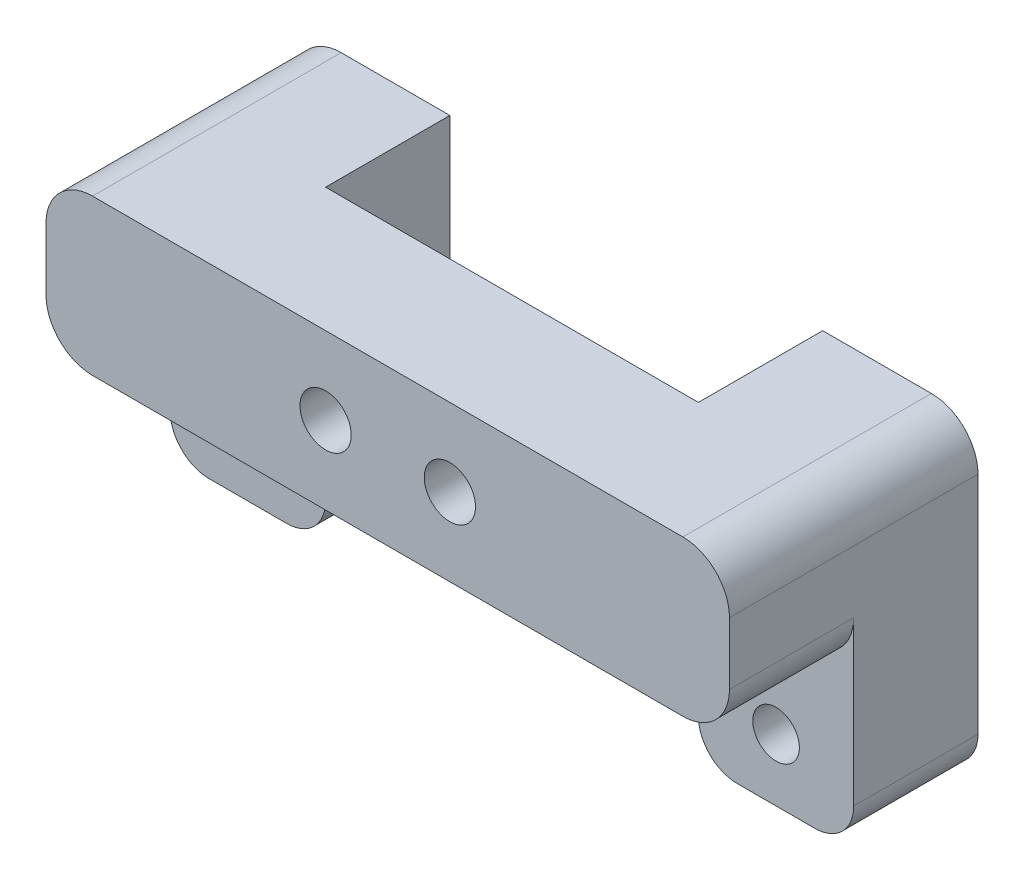
ISO-10303-21;
HEADER;
FILE_DESCRIPTION(('STEP AP214'),'2;1');
FILE_NAME('part.step','',(''),(''),'','','');
FILE_SCHEMA(('AUTOMOTIVE_DESIGN { 1 0 10303 214 1 1 1 1 }'));
ENDSEC;
DATA;
#1=APPLICATION_CONTEXT('core data for automotive mechanical design processes');
#2=APPLICATION_PROTOCOL_DEFINITION('international standard','automotive_design',2000,#1);
#3=PRODUCT_CONTEXT('',#1,'mechanical');
#4=PRODUCT('Part','Part','',(#3));
#5=PRODUCT_RELATED_PRODUCT_CATEGORY('part','',(#4));
#6=PRODUCT_DEFINITION_FORMATION('','',#4);
#7=PRODUCT_DEFINITION_CONTEXT('part definition',#1,'design');
#8=PRODUCT_DEFINITION('design','',#6,#7);
#9=PRODUCT_DEFINITION_SHAPE('','',#8);
#10=(LENGTH_UNIT() NAMED_UNIT(*) SI_UNIT(.MILLI.,.METRE.));
#11=(NAMED_UNIT(*) PLANE_ANGLE_UNIT() SI_UNIT($,.RADIAN.));
#12=(NAMED_UNIT(*) SI_UNIT($,.STERADIAN.) SOLID_ANGLE_UNIT());
#13=UNCERTAINTY_MEASURE_WITH_UNIT(LENGTH_MEASURE(1.E-05),#10,'distance_accuracy_value','');
#14=(GEOMETRIC_REPRESENTATION_CONTEXT(3) GLOBAL_UNCERTAINTY_ASSIGNED_CONTEXT((#13)) GLOBAL_UNIT_ASSIGNED_CONTEXT((#10,
#11,#12)) REPRESENTATION_CONTEXT('',''));
#15=CARTESIAN_POINT('',(0.,0.,0.));
#16=DIRECTION('',(0.,0.,1.));
#17=DIRECTION('',(1.,0.,0.));
#18=AXIS2_PLACEMENT_3D('',#15,#16,#17);
#19=CARTESIAN_POINT('',(0.,-10.,8.));
#20=DIRECTION('',(0.,1.,0.));
#21=DIRECTION('',(0.,0.,1.));
#22=AXIS2_PLACEMENT_3D('',#19,#20,#21);
#23=PLANE('',#22);
#24=DIRECTION('',(1.,0.,0.));
#25=VECTOR('',#24,1.);
#26=CARTESIAN_POINT('',(0.,-10.,8.));
#27=LINE('',#26,#25);
#28=CARTESIAN_POINT('',(3.,-10.,8.));
#29=VERTEX_POINT('',#28);
#30=CARTESIAN_POINT('',(41.,-10.,8.));
#31=VERTEX_POINT('',#30);
#32=EDGE_CURVE('E301',#29,#31,#27,.T.);
#33=ORIENTED_EDGE('',*,*,#32,.F.);
#34=DIRECTION('',(0.,0.,-1.));
#35=VECTOR('',#34,1.);
#36=CARTESIAN_POINT('',(3.,-10.,8.));
#37=LINE('',#36,#35);
#38=CARTESIAN_POINT('',(3.,-10.,0.));
#39=VERTEX_POINT('',#38);
#40=EDGE_CURVE('E254',#29,#39,#37,.T.);
#41=ORIENTED_EDGE('',*,*,#40,.T.);
#42=DIRECTION('',(-1.,0.,0.));
#43=VECTOR('',#42,1.);
#44=CARTESIAN_POINT('',(10.,-10.,0.));
#45=LINE('',#44,#43);
#46=CARTESIAN_POINT('',(10.,-10.,0.));
#47=VERTEX_POINT('',#46);
#48=EDGE_CURVE('E204',#47,#39,#45,.T.);
#49=ORIENTED_EDGE('',*,*,#48,.F.);
#50=DIRECTION('',(1.,0.,0.));
#51=VECTOR('',#50,1.);
#52=CARTESIAN_POINT('',(0.,-10.,0.));
#53=LINE('',#52,#51);
#54=CARTESIAN_POINT('',(34.,-10.,0.));
#55=VERTEX_POINT('',#54);
#56=EDGE_CURVE('E194',#47,#55,#53,.T.);
#57=ORIENTED_EDGE('',*,*,#56,.T.);
#58=DIRECTION('',(-1.,0.,0.));
#59=VECTOR('',#58,1.);
#60=CARTESIAN_POINT('',(34.,-10.,0.));
#61=LINE('',#60,#59);
#62=CARTESIAN_POINT('',(41.,-10.,0.));
#63=VERTEX_POINT('',#62);
#64=EDGE_CURVE('E164',#63,#55,#61,.T.);
#65=ORIENTED_EDGE('',*,*,#64,.F.);
#66=DIRECTION('',(0.,0.,-1.));
#67=VECTOR('',#66,1.);
#68=CARTESIAN_POINT('',(41.,-10.,8.));
#69=LINE('',#68,#67);
#70=EDGE_CURVE('E252',#63,#31,#69,.F.);
#71=ORIENTED_EDGE('',*,*,#70,.T.);
#72=EDGE_LOOP('',(#33,#41,#49,#57,#65,#71));
#73=FACE_BOUND('',#72,.T.);
#74=ADVANCED_FACE('F33',(#73),#23,.F.);
#75=CARTESIAN_POINT('',(0.,0.,0.));
#76=DIRECTION('',(0.,0.,1.));
#77=DIRECTION('',(1.,0.,0.));
#78=AXIS2_PLACEMENT_3D('',#75,#76,#77);
#79=PLANE('',#78);
#80=CARTESIAN_POINT('',(26.,-5.,0.));
#81=DIRECTION('',(0.,0.,1.));
#82=DIRECTION('',(1.,0.,0.));
#83=AXIS2_PLACEMENT_3D('',#80,#81,#82);
#84=CIRCLE('',#83,1.65);
#85=CARTESIAN_POINT('',(27.65,-5.,0.));
#86=VERTEX_POINT('',#85);
#87=EDGE_CURVE('E353',#86,#86,#84,.T.);
#88=ORIENTED_EDGE('',*,*,#87,.T.);
#89=EDGE_LOOP('',(#88));
#90=FACE_BOUND('',#89,.T.);
#91=CARTESIAN_POINT('',(18.,-5.,0.));
#92=DIRECTION('',(0.,0.,1.));
#93=DIRECTION('',(1.,0.,0.));
#94=AXIS2_PLACEMENT_3D('',#91,#92,#93);
#95=CIRCLE('',#94,1.65);
#96=CARTESIAN_POINT('',(19.65,-5.,0.));
#97=VERTEX_POINT('',#96);
#98=EDGE_CURVE('E198',#97,#97,#95,.T.);
#99=ORIENTED_EDGE('',*,*,#98,.T.);
#100=EDGE_LOOP('',(#99));
#101=FACE_BOUND('',#100,.T.);
#102=DIRECTION('',(0.,1.,0.));
#103=VECTOR('',#102,1.);
#104=CARTESIAN_POINT('',(34.,-10.,0.));
#105=LINE('',#104,#103);
#106=CARTESIAN_POINT('',(34.,0.,0.));
#107=VERTEX_POINT('',#106);
#108=EDGE_CURVE('E183',#55,#107,#105,.T.);
#109=ORIENTED_EDGE('',*,*,#108,.F.);
#110=ORIENTED_EDGE('',*,*,#56,.F.);
#111=DIRECTION('',(0.,-1.,0.));
#112=VECTOR('',#111,1.);
#113=CARTESIAN_POINT('',(10.,-10.,0.));
#114=LINE('',#113,#112);
#115=CARTESIAN_POINT('',(10.,0.,0.));
#116=VERTEX_POINT('',#115);
#117=EDGE_CURVE('E319',#116,#47,#114,.T.);
#118=ORIENTED_EDGE('',*,*,#117,.F.);
#119=DIRECTION('',(-1.,0.,0.));
#120=VECTOR('',#119,1.);
#121=CARTESIAN_POINT('',(0.,0.,0.));
#122=LINE('',#121,#120);
#123=EDGE_CURVE('E196',#107,#116,#122,.T.);
#124=ORIENTED_EDGE('',*,*,#123,.F.);
#125=EDGE_LOOP('',(#109,#110,#118,#124));
#126=FACE_BOUND('',#125,.T.);
#127=ADVANCED_FACE('F192',(#90,#101,#126),#79,.F.);
#128=CARTESIAN_POINT('',(0.,0.,8.));
#129=DIRECTION('',(1.,0.,0.));
#130=DIRECTION('',(0.,0.,-1.));
#131=AXIS2_PLACEMENT_3D('',#128,#129,#130);
#132=PLANE('',#131);
#133=DIRECTION('',(0.,1.,0.));
#134=VECTOR('',#133,1.);
#135=CARTESIAN_POINT('',(0.,-20.,0.));
#136=LINE('',#135,#134);
#137=CARTESIAN_POINT('',(0.,-17.5,0.));
#138=VERTEX_POINT('',#137);
#139=CARTESIAN_POINT('',(0.,-7.,0.));
#140=VERTEX_POINT('',#139);
#141=EDGE_CURVE('E285',#138,#140,#136,.T.);
#142=ORIENTED_EDGE('',*,*,#141,.T.);
#143=DIRECTION('',(0.,0.,-1.));
#144=VECTOR('',#143,1.);
#145=CARTESIAN_POINT('',(0.,-7.,8.));
#146=LINE('',#145,#144);
#147=CARTESIAN_POINT('',(0.,-7.,8.));
#148=VERTEX_POINT('',#147);
#149=EDGE_CURVE('E259',#140,#148,#146,.F.);
#150=ORIENTED_EDGE('',*,*,#149,.T.);
#151=DIRECTION('',(0.,-1.,0.));
#152=VECTOR('',#151,1.);
#153=CARTESIAN_POINT('',(0.,0.,8.));
#154=LINE('',#153,#152);
#155=CARTESIAN_POINT('',(0.,-3.,8.));
#156=VERTEX_POINT('',#155);
#157=EDGE_CURVE('E207',#156,#148,#154,.T.);
#158=ORIENTED_EDGE('',*,*,#157,.F.);
#159=DIRECTION('',(0.,0.,-1.));
#160=VECTOR('',#159,1.);
#161=CARTESIAN_POINT('',(0.,-3.,8.));
#162=LINE('',#161,#160);
#163=CARTESIAN_POINT('',(0.,-3.,-8.));
#164=VERTEX_POINT('',#163);
#165=EDGE_CURVE('E256',#156,#164,#162,.T.);
#166=ORIENTED_EDGE('',*,*,#165,.T.);
#167=DIRECTION('',(0.,1.,0.));
#168=VECTOR('',#167,1.);
#169=CARTESIAN_POINT('',(0.,-10.,-8.));
#170=LINE('',#169,#168);
#171=CARTESIAN_POINT('',(0.,-17.5,-8.));
#172=VERTEX_POINT('',#171);
#173=EDGE_CURVE('E314',#172,#164,#170,.T.);
#174=ORIENTED_EDGE('',*,*,#173,.F.);
#175=DIRECTION('',(0.,0.,-1.));
#176=VECTOR('',#175,1.);
#177=CARTESIAN_POINT('',(0.,-17.5,8.));
#178=LINE('',#177,#176);
#179=EDGE_CURVE('E250',#172,#138,#178,.F.);
#180=ORIENTED_EDGE('',*,*,#179,.T.);
#181=EDGE_LOOP('',(#142,#150,#158,#166,#174,#180));
#182=FACE_BOUND('',#181,.T.);
#183=ADVANCED_FACE('F294',(#182),#132,.F.);
#184=CARTESIAN_POINT('',(44.,0.,8.));
#185=DIRECTION('',(-1.,0.,0.));
#186=DIRECTION('',(0.,0.,1.));
#187=AXIS2_PLACEMENT_3D('',#184,#185,#186);
#188=PLANE('',#187);
#189=DIRECTION('',(0.,1.,0.));
#190=VECTOR('',#189,1.);
#191=CARTESIAN_POINT('',(44.,0.,8.));
#192=LINE('',#191,#190);
#193=CARTESIAN_POINT('',(44.,-7.,8.));
#194=VERTEX_POINT('',#193);
#195=CARTESIAN_POINT('',(44.,-3.,8.));
#196=VERTEX_POINT('',#195);
#197=EDGE_CURVE('E303',#194,#196,#192,.T.);
#198=ORIENTED_EDGE('',*,*,#197,.F.);
#199=DIRECTION('',(0.,0.,-1.));
#200=VECTOR('',#199,1.);
#201=CARTESIAN_POINT('',(44.,-7.,8.));
#202=LINE('',#201,#200);
#203=CARTESIAN_POINT('',(44.,-7.,0.));
#204=VERTEX_POINT('',#203);
#205=EDGE_CURVE('E271',#194,#204,#202,.T.);
#206=ORIENTED_EDGE('',*,*,#205,.T.);
#207=DIRECTION('',(0.,1.,0.));
#208=VECTOR('',#207,1.);
#209=CARTESIAN_POINT('',(44.,-20.,0.));
#210=LINE('',#209,#208);
#211=CARTESIAN_POINT('',(44.,-17.5,0.));
#212=VERTEX_POINT('',#211);
#213=EDGE_CURVE('E187',#212,#204,#210,.T.);
#214=ORIENTED_EDGE('',*,*,#213,.F.);
#215=DIRECTION('',(0.,0.,1.));
#216=VECTOR('',#215,1.);
#217=CARTESIAN_POINT('',(44.,-17.5,-8.));
#218=LINE('',#217,#216);
#219=CARTESIAN_POINT('',(44.,-17.5,-8.));
#220=VERTEX_POINT('',#219);
#221=EDGE_CURVE('E226',#212,#220,#218,.F.);
#222=ORIENTED_EDGE('',*,*,#221,.T.);
#223=DIRECTION('',(0.,-1.,0.));
#224=VECTOR('',#223,1.);
#225=CARTESIAN_POINT('',(44.,-10.,-8.));
#226=LINE('',#225,#224);
#227=CARTESIAN_POINT('',(44.,-3.,-8.));
#228=VERTEX_POINT('',#227);
#229=EDGE_CURVE('E197',#228,#220,#226,.T.);
#230=ORIENTED_EDGE('',*,*,#229,.F.);
#231=DIRECTION('',(0.,0.,-1.));
#232=VECTOR('',#231,1.);
#233=CARTESIAN_POINT('',(44.,-3.,8.));
#234=LINE('',#233,#232);
#235=EDGE_CURVE('E269',#228,#196,#234,.F.);
#236=ORIENTED_EDGE('',*,*,#235,.T.);
#237=EDGE_LOOP('',(#198,#206,#214,#222,#230,#236));
#238=FACE_BOUND('',#237,.T.);
#239=ADVANCED_FACE('F420',(#238),#188,.F.);
#240=CARTESIAN_POINT('',(0.,0.,8.));
#241=DIRECTION('',(0.,-1.,0.));
#242=DIRECTION('',(0.,0.,-1.));
#243=AXIS2_PLACEMENT_3D('',#240,#241,#242);
#244=PLANE('',#243);
#245=DIRECTION('',(-1.,0.,0.));
#246=VECTOR('',#245,1.);
#247=CARTESIAN_POINT('',(0.,0.,8.));
#248=LINE('',#247,#246);
#249=CARTESIAN_POINT('',(41.,0.,8.));
#250=VERTEX_POINT('',#249);
#251=CARTESIAN_POINT('',(3.,0.,8.));
#252=VERTEX_POINT('',#251);
#253=EDGE_CURVE('E213',#250,#252,#248,.T.);
#254=ORIENTED_EDGE('',*,*,#253,.F.);
#255=DIRECTION('',(0.,0.,-1.));
#256=VECTOR('',#255,1.);
#257=CARTESIAN_POINT('',(41.,0.,8.));
#258=LINE('',#257,#256);
#259=CARTESIAN_POINT('',(41.,0.,-8.));
#260=VERTEX_POINT('',#259);
#261=EDGE_CURVE('E276',#250,#260,#258,.T.);
#262=ORIENTED_EDGE('',*,*,#261,.T.);
#263=DIRECTION('',(1.,0.,0.));
#264=VECTOR('',#263,1.);
#265=CARTESIAN_POINT('',(44.,0.,-8.));
#266=LINE('',#265,#264);
#267=CARTESIAN_POINT('',(34.,0.,-8.));
#268=VERTEX_POINT('',#267);
#269=EDGE_CURVE('E364',#268,#260,#266,.T.);
#270=ORIENTED_EDGE('',*,*,#269,.F.);
#271=DIRECTION('',(0.,0.,1.));
#272=VECTOR('',#271,1.);
#273=CARTESIAN_POINT('',(34.,0.,-8.));
#274=LINE('',#273,#272);
#275=EDGE_CURVE('E322',#268,#107,#274,.T.);
#276=ORIENTED_EDGE('',*,*,#275,.T.);
#277=ORIENTED_EDGE('',*,*,#123,.T.);
#278=DIRECTION('',(0.,0.,1.));
#279=VECTOR('',#278,1.);
#280=CARTESIAN_POINT('',(10.,0.,-8.));
#281=LINE('',#280,#279);
#282=CARTESIAN_POINT('',(10.,0.,-8.));
#283=VERTEX_POINT('',#282);
#284=EDGE_CURVE('E205',#283,#116,#281,.T.);
#285=ORIENTED_EDGE('',*,*,#284,.F.);
#286=DIRECTION('',(1.,0.,0.));
#287=VECTOR('',#286,1.);
#288=CARTESIAN_POINT('',(0.,0.,-8.));
#289=LINE('',#288,#287);
#290=CARTESIAN_POINT('',(3.,0.,-8.));
#291=VERTEX_POINT('',#290);
#292=EDGE_CURVE('E318',#291,#283,#289,.T.);
#293=ORIENTED_EDGE('',*,*,#292,.F.);
#294=DIRECTION('',(0.,0.,-1.));
#295=VECTOR('',#294,1.);
#296=CARTESIAN_POINT('',(3.,0.,8.));
#297=LINE('',#296,#295);
#298=EDGE_CURVE('E274',#291,#252,#297,.F.);
#299=ORIENTED_EDGE('',*,*,#298,.T.);
#300=EDGE_LOOP('',(#254,#262,#270,#276,#277,#285,#293,#299));
#301=FACE_BOUND('',#300,.T.);
#302=ADVANCED_FACE('F368',(#301),#244,.F.);
#303=CARTESIAN_POINT('',(0.,0.,8.));
#304=DIRECTION('',(0.,0.,1.));
#305=DIRECTION('',(1.,0.,0.));
#306=AXIS2_PLACEMENT_3D('',#303,#304,#305);
#307=PLANE('',#306);
#308=CARTESIAN_POINT('',(26.,-5.,8.));
#309=DIRECTION('',(0.,0.,1.));
#310=DIRECTION('',(1.,0.,0.));
#311=AXIS2_PLACEMENT_3D('',#308,#309,#310);
#312=CIRCLE('',#311,1.65);
#313=CARTESIAN_POINT('',(27.65,-5.,8.));
#314=VERTEX_POINT('',#313);
#315=EDGE_CURVE('E350',#314,#314,#312,.T.);
#316=ORIENTED_EDGE('',*,*,#315,.F.);
#317=EDGE_LOOP('',(#316));
#318=FACE_BOUND('',#317,.T.);
#319=CARTESIAN_POINT('',(18.,-5.,8.));
#320=DIRECTION('',(0.,0.,1.));
#321=DIRECTION('',(1.,0.,0.));
#322=AXIS2_PLACEMENT_3D('',#319,#320,#321);
#323=CIRCLE('',#322,1.65);
#324=CARTESIAN_POINT('',(19.65,-5.,8.));
#325=VERTEX_POINT('',#324);
#326=EDGE_CURVE('E356',#325,#325,#323,.T.);
#327=ORIENTED_EDGE('',*,*,#326,.F.);
#328=EDGE_LOOP('',(#327));
#329=FACE_BOUND('',#328,.T.);
#330=ORIENTED_EDGE('',*,*,#157,.T.);
#331=CARTESIAN_POINT('',(3.,-7.,8.));
#332=DIRECTION('',(0.,0.,1.));
#333=DIRECTION('',(1.,0.,0.));
#334=AXIS2_PLACEMENT_3D('',#331,#332,#333);
#335=CIRCLE('',#334,3.);
#336=EDGE_CURVE('E267',#148,#29,#335,.T.);
#337=ORIENTED_EDGE('',*,*,#336,.T.);
#338=ORIENTED_EDGE('',*,*,#32,.T.);
#339=CARTESIAN_POINT('',(41.,-7.,8.));
#340=DIRECTION('',(0.,0.,1.));
#341=DIRECTION('',(1.,0.,0.));
#342=AXIS2_PLACEMENT_3D('',#339,#340,#341);
#343=CIRCLE('',#342,3.);
#344=EDGE_CURVE('E265',#31,#194,#343,.T.);
#345=ORIENTED_EDGE('',*,*,#344,.T.);
#346=ORIENTED_EDGE('',*,*,#197,.T.);
#347=CARTESIAN_POINT('',(41.,-3.,8.));
#348=DIRECTION('',(0.,0.,1.));
#349=DIRECTION('',(1.,0.,0.));
#350=AXIS2_PLACEMENT_3D('',#347,#348,#349);
#351=CIRCLE('',#350,3.);
#352=EDGE_CURVE('E263',#196,#250,#351,.T.);
#353=ORIENTED_EDGE('',*,*,#352,.T.);
#354=ORIENTED_EDGE('',*,*,#253,.T.);
#355=CARTESIAN_POINT('',(3.,-3.,8.));
#356=DIRECTION('',(0.,0.,1.));
#357=DIRECTION('',(1.,0.,0.));
#358=AXIS2_PLACEMENT_3D('',#355,#356,#357);
#359=CIRCLE('',#358,3.);
#360=EDGE_CURVE('E261',#252,#156,#359,.T.);
#361=ORIENTED_EDGE('',*,*,#360,.T.);
#362=EDGE_LOOP('',(#330,#337,#338,#345,#346,#353,#354,#361));
#363=FACE_BOUND('',#362,.T.);
#364=ADVANCED_FACE('F297',(#318,#329,#363),#307,.T.);
#365=CARTESIAN_POINT('',(10.,-10.,-8.));
#366=DIRECTION('',(-1.,0.,0.));
#367=DIRECTION('',(0.,-1.,0.));
#368=AXIS2_PLACEMENT_3D('',#365,#366,#367);
#369=PLANE('',#368);
#370=DIRECTION('',(0.,1.,0.));
#371=VECTOR('',#370,1.);
#372=CARTESIAN_POINT('',(10.,-20.,0.));
#373=LINE('',#372,#371);
#374=CARTESIAN_POINT('',(10.,-17.5,0.));
#375=VERTEX_POINT('',#374);
#376=EDGE_CURVE('E348',#375,#47,#373,.T.);
#377=ORIENTED_EDGE('',*,*,#376,.F.);
#378=DIRECTION('',(0.,0.,1.));
#379=VECTOR('',#378,1.);
#380=CARTESIAN_POINT('',(10.,-17.5,-8.));
#381=LINE('',#380,#379);
#382=CARTESIAN_POINT('',(10.,-17.5,-8.));
#383=VERTEX_POINT('',#382);
#384=EDGE_CURVE('E244',#375,#383,#381,.F.);
#385=ORIENTED_EDGE('',*,*,#384,.T.);
#386=DIRECTION('',(0.,-1.,0.));
#387=VECTOR('',#386,1.);
#388=CARTESIAN_POINT('',(10.,-10.,-8.));
#389=LINE('',#388,#387);
#390=EDGE_CURVE('E210',#283,#383,#389,.T.);
#391=ORIENTED_EDGE('',*,*,#390,.F.);
#392=ORIENTED_EDGE('',*,*,#284,.T.);
#393=ORIENTED_EDGE('',*,*,#117,.T.);
#394=EDGE_LOOP('',(#377,#385,#391,#392,#393));
#395=FACE_BOUND('',#394,.T.);
#396=ADVANCED_FACE('F467',(#395),#369,.F.);
#397=CARTESIAN_POINT('',(0.,0.,-8.));
#398=DIRECTION('',(0.,0.,-1.));
#399=DIRECTION('',(-1.,0.,0.));
#400=AXIS2_PLACEMENT_3D('',#397,#398,#399);
#401=PLANE('',#400);
#402=CARTESIAN_POINT('',(5.,-16.,-8.));
#403=DIRECTION('',(0.,0.,1.));
#404=DIRECTION('',(1.,0.,0.));
#405=AXIS2_PLACEMENT_3D('',#402,#403,#404);
#406=CIRCLE('',#405,1.5);
#407=CARTESIAN_POINT('',(6.5,-16.,-8.));
#408=VERTEX_POINT('',#407);
#409=EDGE_CURVE('E175',#408,#408,#406,.T.);
#410=ORIENTED_EDGE('',*,*,#409,.T.);
#411=EDGE_LOOP('',(#410));
#412=FACE_BOUND('',#411,.T.);
#413=ORIENTED_EDGE('',*,*,#173,.T.);
#414=CARTESIAN_POINT('',(3.,-3.,-8.));
#415=DIRECTION('',(0.,0.,-1.));
#416=DIRECTION('',(-1.,0.,0.));
#417=AXIS2_PLACEMENT_3D('',#414,#415,#416);
#418=CIRCLE('',#417,3.);
#419=EDGE_CURVE('E48',#164,#291,#418,.T.);
#420=ORIENTED_EDGE('',*,*,#419,.T.);
#421=ORIENTED_EDGE('',*,*,#292,.T.);
#422=ORIENTED_EDGE('',*,*,#390,.T.);
#423=CARTESIAN_POINT('',(7.5,-17.5,-8.));
#424=DIRECTION('',(0.,0.,-1.));
#425=DIRECTION('',(-1.,0.,0.));
#426=AXIS2_PLACEMENT_3D('',#423,#424,#425);
#427=CIRCLE('',#426,2.5);
#428=CARTESIAN_POINT('',(7.5,-20.,-8.));
#429=VERTEX_POINT('',#428);
#430=EDGE_CURVE('E248',#383,#429,#427,.T.);
#431=ORIENTED_EDGE('',*,*,#430,.T.);
#432=DIRECTION('',(1.,0.,0.));
#433=VECTOR('',#432,1.);
#434=CARTESIAN_POINT('',(10.,-20.,-8.));
#435=LINE('',#434,#433);
#436=CARTESIAN_POINT('',(2.5,-20.,-8.));
#437=VERTEX_POINT('',#436);
#438=EDGE_CURVE('E340',#437,#429,#435,.T.);
#439=ORIENTED_EDGE('',*,*,#438,.F.);
#440=CARTESIAN_POINT('',(2.5,-17.5,-8.));
#441=DIRECTION('',(0.,0.,-1.));
#442=DIRECTION('',(-1.,0.,0.));
#443=AXIS2_PLACEMENT_3D('',#440,#441,#442);
#444=CIRCLE('',#443,2.5);
#445=EDGE_CURVE('E246',#437,#172,#444,.T.);
#446=ORIENTED_EDGE('',*,*,#445,.T.);
#447=EDGE_LOOP('',(#413,#420,#421,#422,#431,#439,#446));
#448=FACE_BOUND('',#447,.T.);
#449=ADVANCED_FACE('F316',(#412,#448),#401,.T.);
#450=CARTESIAN_POINT('',(34.,-10.,-8.));
#451=DIRECTION('',(1.,0.,0.));
#452=DIRECTION('',(0.,0.,-1.));
#453=AXIS2_PLACEMENT_3D('',#450,#451,#452);
#454=PLANE('',#453);
#455=DIRECTION('',(0.,1.,0.));
#456=VECTOR('',#455,1.);
#457=CARTESIAN_POINT('',(34.,-10.,-8.));
#458=LINE('',#457,#456);
#459=CARTESIAN_POINT('',(34.,-17.5,-8.));
#460=VERTEX_POINT('',#459);
#461=EDGE_CURVE('E362',#460,#268,#458,.T.);
#462=ORIENTED_EDGE('',*,*,#461,.F.);
#463=DIRECTION('',(0.,0.,-1.));
#464=VECTOR('',#463,1.);
#465=CARTESIAN_POINT('',(34.,-17.5,0.));
#466=LINE('',#465,#464);
#467=CARTESIAN_POINT('',(34.,-17.5,0.));
#468=VERTEX_POINT('',#467);
#469=EDGE_CURVE('E186',#460,#468,#466,.F.);
#470=ORIENTED_EDGE('',*,*,#469,.T.);
#471=DIRECTION('',(0.,1.,0.));
#472=VECTOR('',#471,1.);
#473=CARTESIAN_POINT('',(34.,-20.,0.));
#474=LINE('',#473,#472);
#475=EDGE_CURVE('E168',#468,#55,#474,.T.);
#476=ORIENTED_EDGE('',*,*,#475,.T.);
#477=ORIENTED_EDGE('',*,*,#108,.T.);
#478=ORIENTED_EDGE('',*,*,#275,.F.);
#479=EDGE_LOOP('',(#462,#470,#476,#477,#478));
#480=FACE_BOUND('',#479,.T.);
#481=ADVANCED_FACE('F181',(#480),#454,.F.);
#482=CARTESIAN_POINT('',(0.,0.,-8.));
#483=DIRECTION('',(0.,0.,1.));
#484=DIRECTION('',(1.,0.,0.));
#485=AXIS2_PLACEMENT_3D('',#482,#483,#484);
#486=PLANE('',#485);
#487=CARTESIAN_POINT('',(39.,-16.,-8.));
#488=DIRECTION('',(0.,0.,1.));
#489=DIRECTION('',(1.,0.,0.));
#490=AXIS2_PLACEMENT_3D('',#487,#488,#489);
#491=CIRCLE('',#490,1.5);
#492=CARTESIAN_POINT('',(40.5,-16.,-8.));
#493=VERTEX_POINT('',#492);
#494=EDGE_CURVE('E384',#493,#493,#491,.T.);
#495=ORIENTED_EDGE('',*,*,#494,.T.);
#496=EDGE_LOOP('',(#495));
#497=FACE_BOUND('',#496,.T.);
#498=ORIENTED_EDGE('',*,*,#269,.T.);
#499=CARTESIAN_POINT('',(41.,-3.,-8.));
#500=DIRECTION('',(0.,0.,1.));
#501=DIRECTION('',(1.,0.,0.));
#502=AXIS2_PLACEMENT_3D('',#499,#500,#501);
#503=CIRCLE('',#502,3.);
#504=EDGE_CURVE('E56',#260,#228,#503,.F.);
#505=ORIENTED_EDGE('',*,*,#504,.T.);
#506=ORIENTED_EDGE('',*,*,#229,.T.);
#507=CARTESIAN_POINT('',(41.5,-17.5,-8.));
#508=DIRECTION('',(0.,0.,1.));
#509=DIRECTION('',(1.,0.,0.));
#510=AXIS2_PLACEMENT_3D('',#507,#508,#509);
#511=CIRCLE('',#510,2.5);
#512=CARTESIAN_POINT('',(41.5,-20.,-8.));
#513=VERTEX_POINT('',#512);
#514=EDGE_CURVE('E231',#220,#513,#511,.F.);
#515=ORIENTED_EDGE('',*,*,#514,.T.);
#516=DIRECTION('',(1.,0.,0.));
#517=VECTOR('',#516,1.);
#518=CARTESIAN_POINT('',(34.,-20.,-8.));
#519=LINE('',#518,#517);
#520=CARTESIAN_POINT('',(36.5,-20.,-8.));
#521=VERTEX_POINT('',#520);
#522=EDGE_CURVE('E174',#521,#513,#519,.T.);
#523=ORIENTED_EDGE('',*,*,#522,.F.);
#524=CARTESIAN_POINT('',(36.5,-17.5,-8.));
#525=DIRECTION('',(0.,0.,1.));
#526=DIRECTION('',(1.,0.,0.));
#527=AXIS2_PLACEMENT_3D('',#524,#525,#526);
#528=CIRCLE('',#527,2.5);
#529=EDGE_CURVE('E229',#521,#460,#528,.F.);
#530=ORIENTED_EDGE('',*,*,#529,.T.);
#531=ORIENTED_EDGE('',*,*,#461,.T.);
#532=EDGE_LOOP('',(#498,#505,#506,#515,#523,#530,#531));
#533=FACE_BOUND('',#532,.T.);
#534=ADVANCED_FACE('F393',(#497,#533),#486,.F.);
#535=CARTESIAN_POINT('',(18.,-5.,-8.));
#536=DIRECTION('',(0.,0.,1.));
#537=DIRECTION('',(1.,0.,0.));
#538=AXIS2_PLACEMENT_3D('',#535,#536,#537);
#539=CYLINDRICAL_SURFACE('',#538,1.65);
#540=ORIENTED_EDGE('',*,*,#326,.T.);
#541=EDGE_LOOP('',(#540));
#542=FACE_BOUND('',#541,.T.);
#543=ORIENTED_EDGE('',*,*,#98,.F.);
#544=EDGE_LOOP('',(#543));
#545=FACE_BOUND('',#544,.T.);
#546=ADVANCED_FACE('F453',(#542,#545),#539,.F.);
#547=CARTESIAN_POINT('',(26.,-5.,-8.));
#548=DIRECTION('',(0.,0.,1.));
#549=DIRECTION('',(1.,0.,0.));
#550=AXIS2_PLACEMENT_3D('',#547,#548,#549);
#551=CYLINDRICAL_SURFACE('',#550,1.65);
#552=ORIENTED_EDGE('',*,*,#315,.T.);
#553=EDGE_LOOP('',(#552));
#554=FACE_BOUND('',#553,.T.);
#555=ORIENTED_EDGE('',*,*,#87,.F.);
#556=EDGE_LOOP('',(#555));
#557=FACE_BOUND('',#556,.T.);
#558=ADVANCED_FACE('F459',(#554,#557),#551,.F.);
#559=CARTESIAN_POINT('',(10.,-20.,0.));
#560=DIRECTION('',(0.,0.,-1.));
#561=DIRECTION('',(-1.,0.,0.));
#562=AXIS2_PLACEMENT_3D('',#559,#560,#561);
#563=PLANE('',#562);
#564=CARTESIAN_POINT('',(5.,-16.,0.));
#565=DIRECTION('',(0.,0.,1.));
#566=DIRECTION('',(1.,0.,0.));
#567=AXIS2_PLACEMENT_3D('',#564,#565,#566);
#568=CIRCLE('',#567,1.5);
#569=CARTESIAN_POINT('',(6.5,-16.,0.));
#570=VERTEX_POINT('',#569);
#571=EDGE_CURVE('E381',#570,#570,#568,.T.);
#572=ORIENTED_EDGE('',*,*,#571,.F.);
#573=EDGE_LOOP('',(#572));
#574=FACE_BOUND('',#573,.T.);
#575=DIRECTION('',(-1.,0.,0.));
#576=VECTOR('',#575,1.);
#577=CARTESIAN_POINT('',(10.,-20.,0.));
#578=LINE('',#577,#576);
#579=CARTESIAN_POINT('',(7.5,-20.,0.));
#580=VERTEX_POINT('',#579);
#581=CARTESIAN_POINT('',(2.5,-20.,0.));
#582=VERTEX_POINT('',#581);
#583=EDGE_CURVE('E338',#580,#582,#578,.T.);
#584=ORIENTED_EDGE('',*,*,#583,.F.);
#585=CARTESIAN_POINT('',(7.5,-17.5,0.));
#586=DIRECTION('',(0.,0.,-1.));
#587=DIRECTION('',(-1.,0.,0.));
#588=AXIS2_PLACEMENT_3D('',#585,#586,#587);
#589=CIRCLE('',#588,2.5);
#590=EDGE_CURVE('E242',#580,#375,#589,.F.);
#591=ORIENTED_EDGE('',*,*,#590,.T.);
#592=ORIENTED_EDGE('',*,*,#376,.T.);
#593=ORIENTED_EDGE('',*,*,#48,.T.);
#594=CARTESIAN_POINT('',(3.,-7.,0.));
#595=DIRECTION('',(0.,0.,-1.));
#596=DIRECTION('',(-1.,0.,0.));
#597=AXIS2_PLACEMENT_3D('',#594,#595,#596);
#598=CIRCLE('',#597,3.);
#599=EDGE_CURVE('E41',#39,#140,#598,.T.);
#600=ORIENTED_EDGE('',*,*,#599,.T.);
#601=ORIENTED_EDGE('',*,*,#141,.F.);
#602=CARTESIAN_POINT('',(2.5,-17.5,0.));
#603=DIRECTION('',(0.,0.,-1.));
#604=DIRECTION('',(-1.,0.,0.));
#605=AXIS2_PLACEMENT_3D('',#602,#603,#604);
#606=CIRCLE('',#605,2.5);
#607=EDGE_CURVE('E240',#138,#582,#606,.F.);
#608=ORIENTED_EDGE('',*,*,#607,.T.);
#609=EDGE_LOOP('',(#584,#591,#592,#593,#600,#601,#608));
#610=FACE_BOUND('',#609,.T.);
#611=ADVANCED_FACE('F284',(#574,#610),#563,.F.);
#612=CARTESIAN_POINT('',(0.,-20.,0.));
#613=DIRECTION('',(0.,1.,0.));
#614=DIRECTION('',(0.,0.,1.));
#615=AXIS2_PLACEMENT_3D('',#612,#613,#614);
#616=PLANE('',#615);
#617=ORIENTED_EDGE('',*,*,#438,.T.);
#618=DIRECTION('',(0.,0.,1.));
#619=VECTOR('',#618,1.);
#620=CARTESIAN_POINT('',(7.5,-20.,0.));
#621=LINE('',#620,#619);
#622=EDGE_CURVE('E237',#429,#580,#621,.T.);
#623=ORIENTED_EDGE('',*,*,#622,.T.);
#624=ORIENTED_EDGE('',*,*,#583,.T.);
#625=DIRECTION('',(0.,0.,-1.));
#626=VECTOR('',#625,1.);
#627=CARTESIAN_POINT('',(2.5,-20.,0.));
#628=LINE('',#627,#626);
#629=EDGE_CURVE('E234',#582,#437,#628,.T.);
#630=ORIENTED_EDGE('',*,*,#629,.T.);
#631=EDGE_LOOP('',(#617,#623,#624,#630));
#632=FACE_BOUND('',#631,.T.);
#633=ADVANCED_FACE('F337',(#632),#616,.F.);
#634=CARTESIAN_POINT('',(34.,-20.,0.));
#635=DIRECTION('',(0.,0.,-1.));
#636=DIRECTION('',(-1.,0.,0.));
#637=AXIS2_PLACEMENT_3D('',#634,#635,#636);
#638=PLANE('',#637);
#639=CARTESIAN_POINT('',(39.,-16.,0.));
#640=DIRECTION('',(0.,0.,1.));
#641=DIRECTION('',(1.,0.,0.));
#642=AXIS2_PLACEMENT_3D('',#639,#640,#641);
#643=CIRCLE('',#642,1.5);
#644=CARTESIAN_POINT('',(40.5,-16.,0.));
#645=VERTEX_POINT('',#644);
#646=EDGE_CURVE('E387',#645,#645,#643,.T.);
#647=ORIENTED_EDGE('',*,*,#646,.F.);
#648=EDGE_LOOP('',(#647));
#649=FACE_BOUND('',#648,.T.);
#650=DIRECTION('',(-1.,0.,0.));
#651=VECTOR('',#650,1.);
#652=CARTESIAN_POINT('',(34.,-20.,0.));
#653=LINE('',#652,#651);
#654=CARTESIAN_POINT('',(41.5,-20.,0.));
#655=VERTEX_POINT('',#654);
#656=CARTESIAN_POINT('',(36.5,-20.,0.));
#657=VERTEX_POINT('',#656);
#658=EDGE_CURVE('E188',#655,#657,#653,.T.);
#659=ORIENTED_EDGE('',*,*,#658,.F.);
#660=CARTESIAN_POINT('',(41.5,-17.5,0.));
#661=DIRECTION('',(0.,0.,-1.));
#662=DIRECTION('',(-1.,0.,0.));
#663=AXIS2_PLACEMENT_3D('',#660,#661,#662);
#664=CIRCLE('',#663,2.5);
#665=EDGE_CURVE('E224',#655,#212,#664,.F.);
#666=ORIENTED_EDGE('',*,*,#665,.T.);
#667=ORIENTED_EDGE('',*,*,#213,.T.);
#668=CARTESIAN_POINT('',(41.,-7.,0.));
#669=DIRECTION('',(0.,0.,-1.));
#670=DIRECTION('',(-1.,0.,0.));
#671=AXIS2_PLACEMENT_3D('',#668,#669,#670);
#672=CIRCLE('',#671,3.);
#673=EDGE_CURVE('E11',#204,#63,#672,.T.);
#674=ORIENTED_EDGE('',*,*,#673,.T.);
#675=ORIENTED_EDGE('',*,*,#64,.T.);
#676=ORIENTED_EDGE('',*,*,#475,.F.);
#677=CARTESIAN_POINT('',(36.5,-17.5,0.));
#678=DIRECTION('',(0.,0.,-1.));
#679=DIRECTION('',(-1.,0.,0.));
#680=AXIS2_PLACEMENT_3D('',#677,#678,#679);
#681=CIRCLE('',#680,2.5);
#682=EDGE_CURVE('E222',#468,#657,#681,.F.);
#683=ORIENTED_EDGE('',*,*,#682,.T.);
#684=EDGE_LOOP('',(#659,#666,#667,#674,#675,#676,#683));
#685=FACE_BOUND('',#684,.T.);
#686=ADVANCED_FACE('F167',(#649,#685),#638,.F.);
#687=CARTESIAN_POINT('',(0.,-20.,0.));
#688=DIRECTION('',(0.,-1.,0.));
#689=DIRECTION('',(0.,0.,-1.));
#690=AXIS2_PLACEMENT_3D('',#687,#688,#689);
#691=PLANE('',#690);
#692=ORIENTED_EDGE('',*,*,#522,.T.);
#693=DIRECTION('',(0.,0.,1.));
#694=VECTOR('',#693,1.);
#695=CARTESIAN_POINT('',(41.5,-20.,0.));
#696=LINE('',#695,#694);
#697=EDGE_CURVE('E219',#513,#655,#696,.T.);
#698=ORIENTED_EDGE('',*,*,#697,.T.);
#699=ORIENTED_EDGE('',*,*,#658,.T.);
#700=DIRECTION('',(0.,0.,-1.));
#701=VECTOR('',#700,1.);
#702=CARTESIAN_POINT('',(36.5,-20.,-8.));
#703=LINE('',#702,#701);
#704=EDGE_CURVE('E216',#657,#521,#703,.T.);
#705=ORIENTED_EDGE('',*,*,#704,.T.);
#706=EDGE_LOOP('',(#692,#698,#699,#705));
#707=FACE_BOUND('',#706,.T.);
#708=ADVANCED_FACE('F375',(#707),#691,.T.);
#709=CARTESIAN_POINT('',(5.,-16.,-8.));
#710=DIRECTION('',(0.,0.,1.));
#711=DIRECTION('',(1.,0.,0.));
#712=AXIS2_PLACEMENT_3D('',#709,#710,#711);
#713=CYLINDRICAL_SURFACE('',#712,1.5);
#714=ORIENTED_EDGE('',*,*,#409,.F.);
#715=EDGE_LOOP('',(#714));
#716=FACE_BOUND('',#715,.T.);
#717=ORIENTED_EDGE('',*,*,#571,.T.);
#718=EDGE_LOOP('',(#717));
#719=FACE_BOUND('',#718,.T.);
#720=ADVANCED_FACE('F399',(#716,#719),#713,.F.);
#721=CARTESIAN_POINT('',(39.,-16.,-8.));
#722=DIRECTION('',(0.,0.,1.));
#723=DIRECTION('',(1.,0.,0.));
#724=AXIS2_PLACEMENT_3D('',#721,#722,#723);
#725=CYLINDRICAL_SURFACE('',#724,1.5);
#726=ORIENTED_EDGE('',*,*,#494,.F.);
#727=EDGE_LOOP('',(#726));
#728=FACE_BOUND('',#727,.T.);
#729=ORIENTED_EDGE('',*,*,#646,.T.);
#730=EDGE_LOOP('',(#729));
#731=FACE_BOUND('',#730,.T.);
#732=ADVANCED_FACE('F395',(#728,#731),#725,.F.);
#733=CARTESIAN_POINT('',(41.5,-17.5,0.));
#734=DIRECTION('',(0.,0.,-1.));
#735=DIRECTION('',(-1.,0.,0.));
#736=AXIS2_PLACEMENT_3D('',#733,#734,#735);
#737=CYLINDRICAL_SURFACE('',#736,2.5);
#738=ORIENTED_EDGE('',*,*,#514,.F.);
#739=ORIENTED_EDGE('',*,*,#221,.F.);
#740=ORIENTED_EDGE('',*,*,#665,.F.);
#741=ORIENTED_EDGE('',*,*,#697,.F.);
#742=EDGE_LOOP('',(#738,#739,#740,#741));
#743=FACE_BOUND('',#742,.T.);
#744=ADVANCED_FACE('F398',(#743),#737,.T.);
#745=CARTESIAN_POINT('',(36.5,-17.5,0.));
#746=DIRECTION('',(0.,0.,1.));
#747=DIRECTION('',(1.,0.,0.));
#748=AXIS2_PLACEMENT_3D('',#745,#746,#747);
#749=CYLINDRICAL_SURFACE('',#748,2.5);
#750=ORIENTED_EDGE('',*,*,#682,.F.);
#751=ORIENTED_EDGE('',*,*,#469,.F.);
#752=ORIENTED_EDGE('',*,*,#529,.F.);
#753=ORIENTED_EDGE('',*,*,#704,.F.);
#754=EDGE_LOOP('',(#750,#751,#752,#753));
#755=FACE_BOUND('',#754,.T.);
#756=ADVANCED_FACE('F370',(#755),#749,.T.);
#757=CARTESIAN_POINT('',(7.5,-17.5,0.));
#758=DIRECTION('',(0.,0.,1.));
#759=DIRECTION('',(1.,0.,0.));
#760=AXIS2_PLACEMENT_3D('',#757,#758,#759);
#761=CYLINDRICAL_SURFACE('',#760,2.5);
#762=ORIENTED_EDGE('',*,*,#430,.F.);
#763=ORIENTED_EDGE('',*,*,#384,.F.);
#764=ORIENTED_EDGE('',*,*,#590,.F.);
#765=ORIENTED_EDGE('',*,*,#622,.F.);
#766=EDGE_LOOP('',(#762,#763,#764,#765));
#767=FACE_BOUND('',#766,.T.);
#768=ADVANCED_FACE('F334',(#767),#761,.T.);
#769=CARTESIAN_POINT('',(2.5,-17.5,0.));
#770=DIRECTION('',(0.,0.,-1.));
#771=DIRECTION('',(-1.,0.,0.));
#772=AXIS2_PLACEMENT_3D('',#769,#770,#771);
#773=CYLINDRICAL_SURFACE('',#772,2.5);
#774=ORIENTED_EDGE('',*,*,#607,.F.);
#775=ORIENTED_EDGE('',*,*,#179,.F.);
#776=ORIENTED_EDGE('',*,*,#445,.F.);
#777=ORIENTED_EDGE('',*,*,#629,.F.);
#778=EDGE_LOOP('',(#774,#775,#776,#777));
#779=FACE_BOUND('',#778,.T.);
#780=ADVANCED_FACE('F431',(#779),#773,.T.);
#781=CARTESIAN_POINT('',(3.,-7.,8.));
#782=DIRECTION('',(0.,0.,-1.));
#783=DIRECTION('',(-1.,0.,0.));
#784=AXIS2_PLACEMENT_3D('',#781,#782,#783);
#785=CYLINDRICAL_SURFACE('',#784,3.);
#786=ORIENTED_EDGE('',*,*,#336,.F.);
#787=ORIENTED_EDGE('',*,*,#149,.F.);
#788=ORIENTED_EDGE('',*,*,#599,.F.);
#789=ORIENTED_EDGE('',*,*,#40,.F.);
#790=EDGE_LOOP('',(#786,#787,#788,#789));
#791=FACE_BOUND('',#790,.T.);
#792=ADVANCED_FACE('F290',(#791),#785,.T.);
#793=CARTESIAN_POINT('',(41.,-7.,8.));
#794=DIRECTION('',(0.,0.,-1.));
#795=DIRECTION('',(-1.,0.,0.));
#796=AXIS2_PLACEMENT_3D('',#793,#794,#795);
#797=CYLINDRICAL_SURFACE('',#796,3.);
#798=ORIENTED_EDGE('',*,*,#344,.F.);
#799=ORIENTED_EDGE('',*,*,#70,.F.);
#800=ORIENTED_EDGE('',*,*,#673,.F.);
#801=ORIENTED_EDGE('',*,*,#205,.F.);
#802=EDGE_LOOP('',(#798,#799,#800,#801));
#803=FACE_BOUND('',#802,.T.);
#804=ADVANCED_FACE('F437',(#803),#797,.T.);
#805=CARTESIAN_POINT('',(41.,-3.,8.));
#806=DIRECTION('',(0.,0.,-1.));
#807=DIRECTION('',(-1.,0.,0.));
#808=AXIS2_PLACEMENT_3D('',#805,#806,#807);
#809=CYLINDRICAL_SURFACE('',#808,3.);
#810=ORIENTED_EDGE('',*,*,#352,.F.);
#811=ORIENTED_EDGE('',*,*,#235,.F.);
#812=ORIENTED_EDGE('',*,*,#504,.F.);
#813=ORIENTED_EDGE('',*,*,#261,.F.);
#814=EDGE_LOOP('',(#810,#811,#812,#813));
#815=FACE_BOUND('',#814,.T.);
#816=ADVANCED_FACE('F439',(#815),#809,.T.);
#817=CARTESIAN_POINT('',(3.,-3.,8.));
#818=DIRECTION('',(0.,0.,-1.));
#819=DIRECTION('',(-1.,0.,0.));
#820=AXIS2_PLACEMENT_3D('',#817,#818,#819);
#821=CYLINDRICAL_SURFACE('',#820,3.);
#822=ORIENTED_EDGE('',*,*,#360,.F.);
#823=ORIENTED_EDGE('',*,*,#298,.F.);
#824=ORIENTED_EDGE('',*,*,#419,.F.);
#825=ORIENTED_EDGE('',*,*,#165,.F.);
#826=EDGE_LOOP('',(#822,#823,#824,#825));
#827=FACE_BOUND('',#826,.T.);
#828=ADVANCED_FACE('F35',(#827),#821,.T.);
#829=CLOSED_SHELL('',(#74,#127,#183,#239,#302,#364,#396,#449,#481,#534,#546,#558,#611,#633,#686,
#708,#720,#732,#744,#756,#768,#780,#792,#804,#816,#828));
#830=MANIFOLD_SOLID_BREP('B2',#829);
#831=ADVANCED_BREP_SHAPE_REPRESENTATION('',(#18,#830),#14);
#832=SHAPE_DEFINITION_REPRESENTATION(#9,#831);
ENDSEC;
END-ISO-10303-21;
